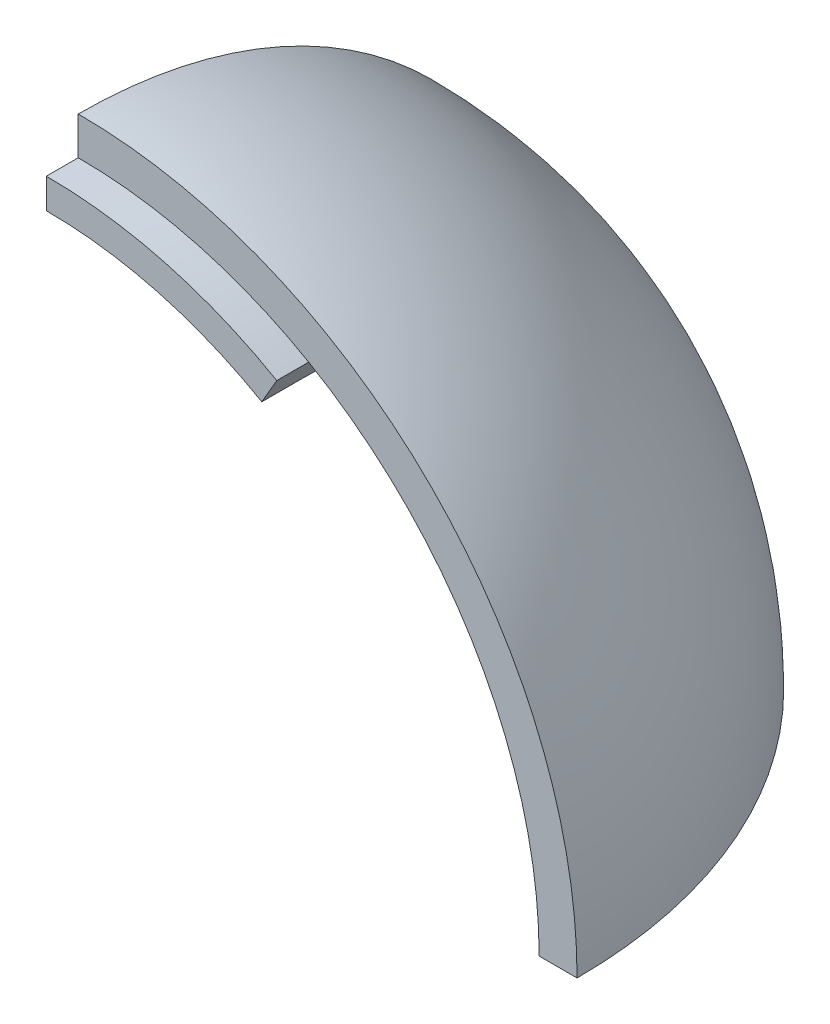
ISO-10303-21;
HEADER;
FILE_DESCRIPTION(('STEP AP214'),'2;1');
FILE_NAME('part.step','',(''),(''),'','','');
FILE_SCHEMA(('AUTOMOTIVE_DESIGN { 1 0 10303 214 1 1 1 1 }'));
ENDSEC;
DATA;
#1=APPLICATION_CONTEXT('core data for automotive mechanical design processes');
#2=APPLICATION_PROTOCOL_DEFINITION('international standard','automotive_design',2000,#1);
#3=PRODUCT_CONTEXT('',#1,'mechanical');
#4=PRODUCT('Part','Part','',(#3));
#5=PRODUCT_RELATED_PRODUCT_CATEGORY('part','',(#4));
#6=PRODUCT_DEFINITION_FORMATION('','',#4);
#7=PRODUCT_DEFINITION_CONTEXT('part definition',#1,'design');
#8=PRODUCT_DEFINITION('design','',#6,#7);
#9=PRODUCT_DEFINITION_SHAPE('','',#8);
#10=(LENGTH_UNIT() NAMED_UNIT(*) SI_UNIT(.MILLI.,.METRE.));
#11=(NAMED_UNIT(*) PLANE_ANGLE_UNIT() SI_UNIT($,.RADIAN.));
#12=(NAMED_UNIT(*) SI_UNIT($,.STERADIAN.) SOLID_ANGLE_UNIT());
#13=UNCERTAINTY_MEASURE_WITH_UNIT(LENGTH_MEASURE(1.E-05),#10,'distance_accuracy_value','');
#14=(GEOMETRIC_REPRESENTATION_CONTEXT(3) GLOBAL_UNCERTAINTY_ASSIGNED_CONTEXT((#13)) GLOBAL_UNIT_ASSIGNED_CONTEXT((#10,
#11,#12)) REPRESENTATION_CONTEXT('',''));
#15=CARTESIAN_POINT('',(0.,0.,0.));
#16=DIRECTION('',(0.,0.,1.));
#17=DIRECTION('',(1.,0.,0.));
#18=AXIS2_PLACEMENT_3D('',#15,#16,#17);
#19=CARTESIAN_POINT('',(0.,0.,0.));
#20=DIRECTION('',(0.,0.,-1.));
#21=DIRECTION('',(1.,0.,0.));
#22=AXIS2_PLACEMENT_3D('',#19,#20,#21);
#23=PLANE('',#22);
#24=DIRECTION('',(-1.,0.,0.));
#25=VECTOR('',#24,1.);
#26=CARTESIAN_POINT('',(0.,0.,0.));
#27=LINE('',#26,#25);
#28=CARTESIAN_POINT('',(125.,0.,0.));
#29=VERTEX_POINT('',#28);
#30=CARTESIAN_POINT('',(115.5,0.,0.));
#31=VERTEX_POINT('',#30);
#32=EDGE_CURVE('E119',#29,#31,#27,.T.);
#33=ORIENTED_EDGE('',*,*,#32,.F.);
#34=CARTESIAN_POINT('',(0.,0.,0.));
#35=DIRECTION('',(0.,0.,-1.));
#36=DIRECTION('',(1.,0.,0.));
#37=AXIS2_PLACEMENT_3D('',#34,#35,#36);
#38=CIRCLE('',#37,125.);
#39=CARTESIAN_POINT('',(0.,125.,-8.72870334710783E-13));
#40=VERTEX_POINT('',#39);
#41=EDGE_CURVE('E118',#40,#29,#38,.T.);
#42=ORIENTED_EDGE('',*,*,#41,.F.);
#43=DIRECTION('',(0.,1.,0.));
#44=VECTOR('',#43,1.);
#45=CARTESIAN_POINT('',(0.,0.,0.));
#46=LINE('',#45,#44);
#47=CARTESIAN_POINT('',(0.,115.5,-1.39645239816133E-12));
#48=VERTEX_POINT('',#47);
#49=EDGE_CURVE('E103',#48,#40,#46,.T.);
#50=ORIENTED_EDGE('',*,*,#49,.F.);
#51=CARTESIAN_POINT('',(0.,0.,0.));
#52=DIRECTION('',(0.,0.,1.));
#53=DIRECTION('',(-0.500000000000004,0.866025403784436,0.));
#54=AXIS2_PLACEMENT_3D('',#51,#52,#53);
#55=CIRCLE('',#54,115.5);
#56=CARTESIAN_POINT('',(57.7499999999998,100.025934137103,-1.39695472976019E-12));
#57=VERTEX_POINT('',#56);
#58=EDGE_CURVE('E151',#57,#48,#55,.T.);
#59=ORIENTED_EDGE('',*,*,#58,.F.);
#60=CARTESIAN_POINT('',(0.,0.,0.));
#61=DIRECTION('',(0.,0.,1.));
#62=DIRECTION('',(1.,0.,0.));
#63=AXIS2_PLACEMENT_3D('',#60,#61,#62);
#64=CIRCLE('',#63,115.5);
#65=EDGE_CURVE('E130',#31,#57,#64,.T.);
#66=ORIENTED_EDGE('',*,*,#65,.F.);
#67=EDGE_LOOP('',(#33,#42,#50,#59,#66));
#68=FACE_BOUND('',#67,.T.);
#69=ADVANCED_FACE('F34',(#68),#23,.F.);
#70=CARTESIAN_POINT('',(0.,0.,0.));
#71=DIRECTION('',(1.,0.,0.));
#72=DIRECTION('',(0.,-1.,0.));
#73=AXIS2_PLACEMENT_3D('',#70,#71,#72);
#74=SPHERICAL_SURFACE('',#73,108.);
#75=CARTESIAN_POINT('',(0.,0.,0.));
#76=DIRECTION('',(-1.,0.,0.));
#77=DIRECTION('',(0.,0.,1.));
#78=AXIS2_PLACEMENT_3D('',#75,#76,#77);
#79=CIRCLE('',#78,108.);
#80=CARTESIAN_POINT('',(0.,108.,-6.53990750443256E-13));
#81=VERTEX_POINT('',#80);
#82=CARTESIAN_POINT('',(0.,0.,-108.));
#83=VERTEX_POINT('',#82);
#84=EDGE_CURVE('E128',#81,#83,#79,.T.);
#85=ORIENTED_EDGE('',*,*,#84,.T.);
#86=CARTESIAN_POINT('',(0.,0.,0.));
#87=DIRECTION('',(0.,-1.,0.));
#88=DIRECTION('',(0.,0.,-1.));
#89=AXIS2_PLACEMENT_3D('',#86,#87,#88);
#90=CIRCLE('',#89,108.);
#91=CARTESIAN_POINT('',(107.70329614269,0.,-8.));
#92=VERTEX_POINT('',#91);
#93=EDGE_CURVE('E115',#83,#92,#90,.T.);
#94=ORIENTED_EDGE('',*,*,#93,.T.);
#95=CARTESIAN_POINT('',(0.,0.,-8.));
#96=DIRECTION('',(0.,0.,1.));
#97=DIRECTION('',(1.,0.,0.));
#98=AXIS2_PLACEMENT_3D('',#95,#96,#97);
#99=CIRCLE('',#98,107.70329614269);
#100=CARTESIAN_POINT('',(53.8516480713448,93.2737905308883,-8.));
#101=VERTEX_POINT('',#100);
#102=EDGE_CURVE('E43',#92,#101,#99,.T.);
#103=ORIENTED_EDGE('',*,*,#102,.T.);
#104=CARTESIAN_POINT('',(-2.88444402957534E-13,1.66533453693774E-13,0.));
#105=DIRECTION('',(-0.866025403784438,0.500000000000001,0.));
#106=DIRECTION('',(-0.500000000000001,-0.866025403784438,0.));
#107=AXIS2_PLACEMENT_3D('',#104,#105,#106);
#108=CIRCLE('',#107,108.);
#109=CARTESIAN_POINT('',(53.9999999999998,93.5307436087195,0.));
#110=VERTEX_POINT('',#109);
#111=EDGE_CURVE('E12',#110,#101,#108,.T.);
#112=ORIENTED_EDGE('',*,*,#111,.F.);
#113=CARTESIAN_POINT('',(0.,0.,0.));
#114=DIRECTION('',(0.,0.,-1.));
#115=DIRECTION('',(-0.500000000000004,0.866025403784436,0.));
#116=AXIS2_PLACEMENT_3D('',#113,#114,#115);
#117=CIRCLE('',#116,108.);
#118=EDGE_CURVE('E146',#81,#110,#117,.T.);
#119=ORIENTED_EDGE('',*,*,#118,.F.);
#120=EDGE_LOOP('',(#85,#94,#103,#112,#119));
#121=FACE_BOUND('',#120,.T.);
#122=ADVANCED_FACE('F168',(#121),#74,.F.);
#123=CARTESIAN_POINT('',(0.,0.,0.));
#124=DIRECTION('',(1.,0.,0.));
#125=DIRECTION('',(0.,1.,0.));
#126=AXIS2_PLACEMENT_3D('',#123,#124,#125);
#127=SPHERICAL_SURFACE('',#126,125.);
#128=ORIENTED_EDGE('',*,*,#41,.T.);
#129=CARTESIAN_POINT('',(0.,0.,0.));
#130=DIRECTION('',(0.,-1.,0.));
#131=DIRECTION('',(0.,0.,-1.));
#132=AXIS2_PLACEMENT_3D('',#129,#130,#131);
#133=CIRCLE('',#132,125.);
#134=CARTESIAN_POINT('',(0.,0.,-125.));
#135=VERTEX_POINT('',#134);
#136=EDGE_CURVE('E112',#29,#135,#133,.F.);
#137=ORIENTED_EDGE('',*,*,#136,.T.);
#138=CARTESIAN_POINT('',(0.,0.,0.));
#139=DIRECTION('',(-1.,0.,0.));
#140=DIRECTION('',(0.,0.,1.));
#141=AXIS2_PLACEMENT_3D('',#138,#139,#140);
#142=CIRCLE('',#141,125.);
#143=EDGE_CURVE('E97',#135,#40,#142,.F.);
#144=ORIENTED_EDGE('',*,*,#143,.T.);
#145=EDGE_LOOP('',(#128,#137,#144));
#146=FACE_BOUND('',#145,.T.);
#147=ADVANCED_FACE('F36',(#146),#127,.T.);
#148=CARTESIAN_POINT('',(0.,0.,8.));
#149=DIRECTION('',(0.,0.,-1.));
#150=DIRECTION('',(0.,1.,0.));
#151=AXIS2_PLACEMENT_3D('',#148,#149,#150);
#152=CYLINDRICAL_SURFACE('',#151,108.);
#153=DIRECTION('',(0.,0.,-1.));
#154=VECTOR('',#153,1.);
#155=CARTESIAN_POINT('',(0.,108.,7.99999999999887));
#156=LINE('',#155,#154);
#157=CARTESIAN_POINT('',(0.,108.,8.0000000000007));
#158=VERTEX_POINT('',#157);
#159=EDGE_CURVE('E108',#81,#158,#156,.F.);
#160=ORIENTED_EDGE('',*,*,#159,.F.);
#161=ORIENTED_EDGE('',*,*,#118,.T.);
#162=DIRECTION('',(0.,0.,-1.));
#163=VECTOR('',#162,1.);
#164=CARTESIAN_POINT('',(53.9999999999998,93.5307436087196,7.99999999999869));
#165=LINE('',#164,#163);
#166=CARTESIAN_POINT('',(53.9999999999998,93.5307436087196,7.99999999999869));
#167=VERTEX_POINT('',#166);
#168=EDGE_CURVE('E161',#167,#110,#165,.T.);
#169=ORIENTED_EDGE('',*,*,#168,.F.);
#170=CARTESIAN_POINT('',(0.,0.,8.));
#171=DIRECTION('',(0.,0.,-1.));
#172=DIRECTION('',(-0.500000000000004,0.866025403784436,0.));
#173=AXIS2_PLACEMENT_3D('',#170,#171,#172);
#174=CIRCLE('',#173,108.);
#175=EDGE_CURVE('E149',#158,#167,#174,.T.);
#176=ORIENTED_EDGE('',*,*,#175,.F.);
#177=EDGE_LOOP('',(#160,#161,#169,#176));
#178=FACE_BOUND('',#177,.T.);
#179=ADVANCED_FACE('F180',(#178),#152,.F.);
#180=CARTESIAN_POINT('',(0.,0.,8.));
#181=DIRECTION('',(0.,0.,-1.));
#182=DIRECTION('',(0.,1.,0.));
#183=AXIS2_PLACEMENT_3D('',#180,#181,#182);
#184=CYLINDRICAL_SURFACE('',#183,115.5);
#185=DIRECTION('',(0.,0.,-1.));
#186=VECTOR('',#185,1.);
#187=CARTESIAN_POINT('',(0.,115.5,7.99999999999879));
#188=LINE('',#187,#186);
#189=CARTESIAN_POINT('',(0.,115.5,8.0000000000007));
#190=VERTEX_POINT('',#189);
#191=EDGE_CURVE('E121',#190,#48,#188,.T.);
#192=ORIENTED_EDGE('',*,*,#191,.F.);
#193=CARTESIAN_POINT('',(0.,0.,8.));
#194=DIRECTION('',(0.,0.,1.));
#195=DIRECTION('',(-0.500000000000004,0.866025403784436,0.));
#196=AXIS2_PLACEMENT_3D('',#193,#194,#195);
#197=CIRCLE('',#196,115.5);
#198=CARTESIAN_POINT('',(57.7499999999998,100.025934137103,7.9999999999986));
#199=VERTEX_POINT('',#198);
#200=EDGE_CURVE('E153',#199,#190,#197,.T.);
#201=ORIENTED_EDGE('',*,*,#200,.F.);
#202=DIRECTION('',(0.,0.,-1.));
#203=VECTOR('',#202,1.);
#204=CARTESIAN_POINT('',(57.7499999999998,100.025934137103,7.9999999999986));
#205=LINE('',#204,#203);
#206=EDGE_CURVE('E155',#199,#57,#205,.T.);
#207=ORIENTED_EDGE('',*,*,#206,.T.);
#208=ORIENTED_EDGE('',*,*,#58,.T.);
#209=EDGE_LOOP('',(#192,#201,#207,#208));
#210=FACE_BOUND('',#209,.T.);
#211=ADVANCED_FACE('F187',(#210),#184,.T.);
#212=CARTESIAN_POINT('',(0.,0.,8.));
#213=DIRECTION('',(0.,0.,1.));
#214=DIRECTION('',(-0.500000000000004,0.866025403784436,0.));
#215=AXIS2_PLACEMENT_3D('',#212,#213,#214);
#216=PLANE('',#215);
#217=ORIENTED_EDGE('',*,*,#200,.T.);
#218=DIRECTION('',(0.,-1.,0.));
#219=VECTOR('',#218,1.);
#220=CARTESIAN_POINT('',(0.,0.,8.0000000000007));
#221=LINE('',#220,#219);
#222=EDGE_CURVE('E116',#190,#158,#221,.T.);
#223=ORIENTED_EDGE('',*,*,#222,.T.);
#224=ORIENTED_EDGE('',*,*,#175,.T.);
#225=DIRECTION('',(0.499999999999997,0.86602540378444,0.));
#226=VECTOR('',#225,1.);
#227=CARTESIAN_POINT('',(53.9999999999998,93.5307436087196,7.99999999999869));
#228=LINE('',#227,#226);
#229=EDGE_CURVE('E50',#167,#199,#228,.T.);
#230=ORIENTED_EDGE('',*,*,#229,.T.);
#231=EDGE_LOOP('',(#217,#223,#224,#230));
#232=FACE_BOUND('',#231,.T.);
#233=ADVANCED_FACE('F183',(#232),#216,.T.);
#234=CARTESIAN_POINT('',(53.9999999999998,93.5307436087196,7.99999999999869));
#235=DIRECTION('',(-0.86602540378444,0.499999999999997,0.));
#236=DIRECTION('',(-0.499999999999997,-0.86602540378444,0.));
#237=AXIS2_PLACEMENT_3D('',#234,#235,#236);
#238=PLANE('',#237);
#239=ORIENTED_EDGE('',*,*,#168,.T.);
#240=ORIENTED_EDGE('',*,*,#111,.T.);
#241=DIRECTION('',(-0.500000000000001,-0.866025403784438,0.));
#242=VECTOR('',#241,1.);
#243=CARTESIAN_POINT('',(57.7499999999998,100.025934137103,-8.));
#244=LINE('',#243,#242);
#245=CARTESIAN_POINT('',(57.7499999999998,100.025934137103,-8.));
#246=VERTEX_POINT('',#245);
#247=EDGE_CURVE('E134',#246,#101,#244,.T.);
#248=ORIENTED_EDGE('',*,*,#247,.F.);
#249=DIRECTION('',(0.,0.,1.));
#250=VECTOR('',#249,1.);
#251=CARTESIAN_POINT('',(57.7499999999998,100.025934137103,-8.));
#252=LINE('',#251,#250);
#253=EDGE_CURVE('E140',#246,#57,#252,.T.);
#254=ORIENTED_EDGE('',*,*,#253,.T.);
#255=ORIENTED_EDGE('',*,*,#206,.F.);
#256=ORIENTED_EDGE('',*,*,#229,.F.);
#257=EDGE_LOOP('',(#239,#240,#248,#254,#255,#256));
#258=FACE_BOUND('',#257,.T.);
#259=ADVANCED_FACE('F175',(#258),#238,.F.);
#260=CARTESIAN_POINT('',(0.,0.,-8.));
#261=DIRECTION('',(0.,0.,1.));
#262=DIRECTION('',(1.,0.,0.));
#263=AXIS2_PLACEMENT_3D('',#260,#261,#262);
#264=CYLINDRICAL_SURFACE('',#263,115.5);
#265=ORIENTED_EDGE('',*,*,#65,.T.);
#266=ORIENTED_EDGE('',*,*,#253,.F.);
#267=CARTESIAN_POINT('',(0.,0.,-8.));
#268=DIRECTION('',(0.,0.,1.));
#269=DIRECTION('',(1.,0.,0.));
#270=AXIS2_PLACEMENT_3D('',#267,#268,#269);
#271=CIRCLE('',#270,115.5);
#272=CARTESIAN_POINT('',(115.5,0.,-8.));
#273=VERTEX_POINT('',#272);
#274=EDGE_CURVE('E131',#273,#246,#271,.T.);
#275=ORIENTED_EDGE('',*,*,#274,.F.);
#276=DIRECTION('',(0.,0.,1.));
#277=VECTOR('',#276,1.);
#278=CARTESIAN_POINT('',(115.5,0.,-8.));
#279=LINE('',#278,#277);
#280=EDGE_CURVE('E143',#273,#31,#279,.T.);
#281=ORIENTED_EDGE('',*,*,#280,.T.);
#282=EDGE_LOOP('',(#265,#266,#275,#281));
#283=FACE_BOUND('',#282,.T.);
#284=ADVANCED_FACE('F192',(#283),#264,.F.);
#285=CARTESIAN_POINT('',(0.,0.,-8.));
#286=DIRECTION('',(0.,0.,1.));
#287=DIRECTION('',(1.,0.,0.));
#288=AXIS2_PLACEMENT_3D('',#285,#286,#287);
#289=PLANE('',#288);
#290=DIRECTION('',(1.,0.,0.));
#291=VECTOR('',#290,1.);
#292=CARTESIAN_POINT('',(100.721513973529,0.,-8.));
#293=LINE('',#292,#291);
#294=EDGE_CURVE('E137',#92,#273,#293,.T.);
#295=ORIENTED_EDGE('',*,*,#294,.T.);
#296=ORIENTED_EDGE('',*,*,#274,.T.);
#297=ORIENTED_EDGE('',*,*,#247,.T.);
#298=ORIENTED_EDGE('',*,*,#102,.F.);
#299=EDGE_LOOP('',(#295,#296,#297,#298));
#300=FACE_BOUND('',#299,.T.);
#301=ADVANCED_FACE('F171',(#300),#289,.T.);
#302=CARTESIAN_POINT('',(171.43340680163,0.,-125.));
#303=DIRECTION('',(0.,-1.,0.));
#304=DIRECTION('',(0.,0.,-1.));
#305=AXIS2_PLACEMENT_3D('',#302,#303,#304);
#306=PLANE('',#305);
#307=ORIENTED_EDGE('',*,*,#32,.T.);
#308=ORIENTED_EDGE('',*,*,#280,.F.);
#309=ORIENTED_EDGE('',*,*,#294,.F.);
#310=ORIENTED_EDGE('',*,*,#93,.F.);
#311=DIRECTION('',(0.,0.,1.));
#312=VECTOR('',#311,1.);
#313=CARTESIAN_POINT('',(0.,0.,-125.));
#314=LINE('',#313,#312);
#315=EDGE_CURVE('E100',#135,#83,#314,.T.);
#316=ORIENTED_EDGE('',*,*,#315,.F.);
#317=ORIENTED_EDGE('',*,*,#136,.F.);
#318=EDGE_LOOP('',(#307,#308,#309,#310,#316,#317));
#319=FACE_BOUND('',#318,.T.);
#320=ADVANCED_FACE('F111',(#319),#306,.T.);
#321=CARTESIAN_POINT('',(0.,0.,-125.));
#322=DIRECTION('',(-1.,0.,0.));
#323=DIRECTION('',(0.,0.,1.));
#324=AXIS2_PLACEMENT_3D('',#321,#322,#323);
#325=PLANE('',#324);
#326=ORIENTED_EDGE('',*,*,#159,.T.);
#327=ORIENTED_EDGE('',*,*,#222,.F.);
#328=ORIENTED_EDGE('',*,*,#191,.T.);
#329=ORIENTED_EDGE('',*,*,#49,.T.);
#330=ORIENTED_EDGE('',*,*,#143,.F.);
#331=ORIENTED_EDGE('',*,*,#315,.T.);
#332=ORIENTED_EDGE('',*,*,#84,.F.);
#333=EDGE_LOOP('',(#326,#327,#328,#329,#330,#331,#332));
#334=FACE_BOUND('',#333,.T.);
#335=ADVANCED_FACE('F99',(#334),#325,.T.);
#336=CLOSED_SHELL('',(#69,#122,#147,#179,#211,#233,#259,#284,#301,#320,#335));
#337=MANIFOLD_SOLID_BREP('B2',#336);
#338=ADVANCED_BREP_SHAPE_REPRESENTATION('',(#18,#337),#14);
#339=SHAPE_DEFINITION_REPRESENTATION(#9,#338);
ENDSEC;
END-ISO-10303-21;
